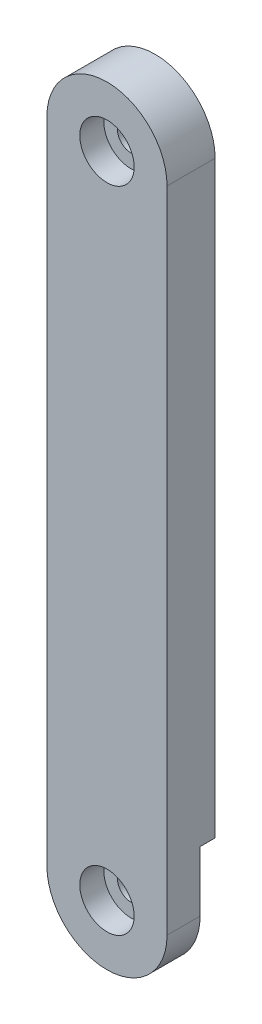
ISO-10303-21;
HEADER;
FILE_DESCRIPTION(('STEP AP214'),'2;1');
FILE_NAME('part.step','',(''),(''),'','','');
FILE_SCHEMA(('AUTOMOTIVE_DESIGN { 1 0 10303 214 1 1 1 1 }'));
ENDSEC;
DATA;
#1=APPLICATION_CONTEXT('core data for automotive mechanical design processes');
#2=APPLICATION_PROTOCOL_DEFINITION('international standard','automotive_design',2000,#1);
#3=PRODUCT_CONTEXT('',#1,'mechanical');
#4=PRODUCT('Part','Part','',(#3));
#5=PRODUCT_RELATED_PRODUCT_CATEGORY('part','',(#4));
#6=PRODUCT_DEFINITION_FORMATION('','',#4);
#7=PRODUCT_DEFINITION_CONTEXT('part definition',#1,'design');
#8=PRODUCT_DEFINITION('design','',#6,#7);
#9=PRODUCT_DEFINITION_SHAPE('','',#8);
#10=(LENGTH_UNIT() NAMED_UNIT(*) SI_UNIT(.MILLI.,.METRE.));
#11=(NAMED_UNIT(*) PLANE_ANGLE_UNIT() SI_UNIT($,.RADIAN.));
#12=(NAMED_UNIT(*) SI_UNIT($,.STERADIAN.) SOLID_ANGLE_UNIT());
#13=UNCERTAINTY_MEASURE_WITH_UNIT(LENGTH_MEASURE(1.E-05),#10,'distance_accuracy_value','');
#14=(GEOMETRIC_REPRESENTATION_CONTEXT(3) GLOBAL_UNCERTAINTY_ASSIGNED_CONTEXT((#13)) GLOBAL_UNIT_ASSIGNED_CONTEXT((#10,
#11,#12)) REPRESENTATION_CONTEXT('',''));
#15=CARTESIAN_POINT('',(0.,0.,0.));
#16=DIRECTION('',(0.,0.,1.));
#17=DIRECTION('',(1.,0.,0.));
#18=AXIS2_PLACEMENT_3D('',#15,#16,#17);
#19=CARTESIAN_POINT('',(0.,0.,0.));
#20=DIRECTION('',(0.,0.,1.));
#21=DIRECTION('',(1.,0.,0.));
#22=AXIS2_PLACEMENT_3D('',#19,#20,#21);
#23=PLANE('',#22);
#24=CARTESIAN_POINT('',(0.,108.,0.));
#25=DIRECTION('',(0.,0.,1.));
#26=DIRECTION('',(1.,0.,0.));
#27=AXIS2_PLACEMENT_3D('',#24,#25,#26);
#28=CIRCLE('',#27,2.25);
#29=CARTESIAN_POINT('',(2.25,108.,0.));
#30=VERTEX_POINT('',#29);
#31=EDGE_CURVE('E193',#30,#30,#28,.T.);
#32=ORIENTED_EDGE('',*,*,#31,.T.);
#33=EDGE_LOOP('',(#32));
#34=FACE_BOUND('',#33,.T.);
#35=CARTESIAN_POINT('',(0.,0.,0.));
#36=DIRECTION('',(0.,0.,1.));
#37=DIRECTION('',(1.,0.,0.));
#38=AXIS2_PLACEMENT_3D('',#35,#36,#37);
#39=CIRCLE('',#38,14.1509716980849);
#40=CARTESIAN_POINT('',(10.,10.0124921972504,0.));
#41=VERTEX_POINT('',#40);
#42=CARTESIAN_POINT('',(7.5,12.,0.));
#43=VERTEX_POINT('',#42);
#44=EDGE_CURVE('E261',#41,#43,#39,.T.);
#45=ORIENTED_EDGE('',*,*,#44,.T.);
#46=DIRECTION('',(0.,1.,0.));
#47=VECTOR('',#46,1.);
#48=CARTESIAN_POINT('',(7.5,12.,0.));
#49=LINE('',#48,#47);
#50=CARTESIAN_POINT('',(7.5,96.,0.));
#51=VERTEX_POINT('',#50);
#52=EDGE_CURVE('E160',#43,#51,#49,.T.);
#53=ORIENTED_EDGE('',*,*,#52,.T.);
#54=CARTESIAN_POINT('',(0.,108.,0.));
#55=DIRECTION('',(0.,0.,-1.));
#56=DIRECTION('',(-1.,0.,0.));
#57=AXIS2_PLACEMENT_3D('',#54,#55,#56);
#58=CIRCLE('',#57,14.1509716980849);
#59=CARTESIAN_POINT('',(-7.49999999999999,96.,0.));
#60=VERTEX_POINT('',#59);
#61=EDGE_CURVE('E264',#51,#60,#58,.T.);
#62=ORIENTED_EDGE('',*,*,#61,.T.);
#63=DIRECTION('',(0.,-1.,0.));
#64=VECTOR('',#63,1.);
#65=CARTESIAN_POINT('',(-7.5,96.,0.));
#66=LINE('',#65,#64);
#67=CARTESIAN_POINT('',(-7.5,12.,0.));
#68=VERTEX_POINT('',#67);
#69=EDGE_CURVE('E145',#60,#68,#66,.T.);
#70=ORIENTED_EDGE('',*,*,#69,.T.);
#71=CARTESIAN_POINT('',(-10.,10.0124921972504,0.));
#72=VERTEX_POINT('',#71);
#73=EDGE_CURVE('E254',#68,#72,#39,.T.);
#74=ORIENTED_EDGE('',*,*,#73,.T.);
#75=DIRECTION('',(0.,-1.,0.));
#76=VECTOR('',#75,1.);
#77=CARTESIAN_POINT('',(-10.,108.,0.));
#78=LINE('',#77,#76);
#79=CARTESIAN_POINT('',(-10.,108.,0.));
#80=VERTEX_POINT('',#79);
#81=EDGE_CURVE('E201',#80,#72,#78,.T.);
#82=ORIENTED_EDGE('',*,*,#81,.F.);
#83=CARTESIAN_POINT('',(0.,108.,0.));
#84=DIRECTION('',(0.,0.,1.));
#85=DIRECTION('',(1.,0.,0.));
#86=AXIS2_PLACEMENT_3D('',#83,#84,#85);
#87=CIRCLE('',#86,10.);
#88=CARTESIAN_POINT('',(10.,108.,0.));
#89=VERTEX_POINT('',#88);
#90=EDGE_CURVE('E88',#89,#80,#87,.T.);
#91=ORIENTED_EDGE('',*,*,#90,.F.);
#92=DIRECTION('',(0.,1.,0.));
#93=VECTOR('',#92,1.);
#94=CARTESIAN_POINT('',(10.,0.,0.));
#95=LINE('',#94,#93);
#96=EDGE_CURVE('E196',#41,#89,#95,.T.);
#97=ORIENTED_EDGE('',*,*,#96,.F.);
#98=EDGE_LOOP('',(#45,#53,#62,#70,#74,#82,#91,#97));
#99=FACE_BOUND('',#98,.T.);
#100=ADVANCED_FACE('F44',(#34,#99),#23,.F.);
#101=CARTESIAN_POINT('',(10.,0.,8.));
#102=DIRECTION('',(-1.,0.,0.));
#103=DIRECTION('',(0.,0.,1.));
#104=AXIS2_PLACEMENT_3D('',#101,#102,#103);
#105=PLANE('',#104);
#106=DIRECTION('',(0.,0.,-1.));
#107=VECTOR('',#106,1.);
#108=CARTESIAN_POINT('',(10.,10.0124921972504,2.5));
#109=LINE('',#108,#107);
#110=CARTESIAN_POINT('',(10.,10.0124921972504,2.5));
#111=VERTEX_POINT('',#110);
#112=EDGE_CURVE('E137',#41,#111,#109,.F.);
#113=ORIENTED_EDGE('',*,*,#112,.F.);
#114=ORIENTED_EDGE('',*,*,#96,.T.);
#115=DIRECTION('',(0.,0.,-1.));
#116=VECTOR('',#115,1.);
#117=CARTESIAN_POINT('',(10.,108.,8.));
#118=LINE('',#117,#116);
#119=CARTESIAN_POINT('',(10.,108.,8.));
#120=VERTEX_POINT('',#119);
#121=EDGE_CURVE('E223',#120,#89,#118,.T.);
#122=ORIENTED_EDGE('',*,*,#121,.F.);
#123=DIRECTION('',(0.,1.,0.));
#124=VECTOR('',#123,1.);
#125=CARTESIAN_POINT('',(10.,0.,8.));
#126=LINE('',#125,#124);
#127=CARTESIAN_POINT('',(10.,0.,8.));
#128=VERTEX_POINT('',#127);
#129=EDGE_CURVE('E94',#128,#120,#126,.T.);
#130=ORIENTED_EDGE('',*,*,#129,.F.);
#131=DIRECTION('',(0.,0.,-1.));
#132=VECTOR('',#131,1.);
#133=CARTESIAN_POINT('',(10.,0.,8.));
#134=LINE('',#133,#132);
#135=CARTESIAN_POINT('',(10.,0.,2.5));
#136=VERTEX_POINT('',#135);
#137=EDGE_CURVE('E229',#128,#136,#134,.T.);
#138=ORIENTED_EDGE('',*,*,#137,.T.);
#139=DIRECTION('',(0.,1.,0.));
#140=VECTOR('',#139,1.);
#141=CARTESIAN_POINT('',(10.,0.,2.5));
#142=LINE('',#141,#140);
#143=EDGE_CURVE('E162',#136,#111,#142,.T.);
#144=ORIENTED_EDGE('',*,*,#143,.T.);
#145=EDGE_LOOP('',(#113,#114,#122,#130,#138,#144));
#146=FACE_BOUND('',#145,.T.);
#147=ADVANCED_FACE('F246',(#146),#105,.F.);
#148=CARTESIAN_POINT('',(-10.,108.,8.));
#149=DIRECTION('',(1.,0.,0.));
#150=DIRECTION('',(0.,0.,-1.));
#151=AXIS2_PLACEMENT_3D('',#148,#149,#150);
#152=PLANE('',#151);
#153=DIRECTION('',(0.,0.,-1.));
#154=VECTOR('',#153,1.);
#155=CARTESIAN_POINT('',(-10.,10.0124921972504,2.5));
#156=LINE('',#155,#154);
#157=CARTESIAN_POINT('',(-10.,10.0124921972504,2.5));
#158=VERTEX_POINT('',#157);
#159=EDGE_CURVE('E11',#158,#72,#156,.T.);
#160=ORIENTED_EDGE('',*,*,#159,.F.);
#161=DIRECTION('',(0.,-1.,0.));
#162=VECTOR('',#161,1.);
#163=CARTESIAN_POINT('',(-10.,108.,2.5));
#164=LINE('',#163,#162);
#165=CARTESIAN_POINT('',(-10.,0.,2.5));
#166=VERTEX_POINT('',#165);
#167=EDGE_CURVE('E53',#158,#166,#164,.T.);
#168=ORIENTED_EDGE('',*,*,#167,.T.);
#169=DIRECTION('',(0.,0.,-1.));
#170=VECTOR('',#169,1.);
#171=CARTESIAN_POINT('',(-10.,0.,8.));
#172=LINE('',#171,#170);
#173=CARTESIAN_POINT('',(-10.,0.,8.));
#174=VERTEX_POINT('',#173);
#175=EDGE_CURVE('E211',#174,#166,#172,.T.);
#176=ORIENTED_EDGE('',*,*,#175,.F.);
#177=DIRECTION('',(0.,-1.,0.));
#178=VECTOR('',#177,1.);
#179=CARTESIAN_POINT('',(-10.,108.,8.));
#180=LINE('',#179,#178);
#181=CARTESIAN_POINT('',(-10.,108.,8.));
#182=VERTEX_POINT('',#181);
#183=EDGE_CURVE('E67',#182,#174,#180,.T.);
#184=ORIENTED_EDGE('',*,*,#183,.F.);
#185=DIRECTION('',(0.,0.,-1.));
#186=VECTOR('',#185,1.);
#187=CARTESIAN_POINT('',(-10.,108.,8.));
#188=LINE('',#187,#186);
#189=EDGE_CURVE('E225',#182,#80,#188,.T.);
#190=ORIENTED_EDGE('',*,*,#189,.T.);
#191=ORIENTED_EDGE('',*,*,#81,.T.);
#192=EDGE_LOOP('',(#160,#168,#176,#184,#190,#191));
#193=FACE_BOUND('',#192,.T.);
#194=ADVANCED_FACE('F239',(#193),#152,.F.);
#195=CARTESIAN_POINT('',(0.,0.,8.));
#196=DIRECTION('',(0.,0.,-1.));
#197=DIRECTION('',(-1.,0.,0.));
#198=AXIS2_PLACEMENT_3D('',#195,#196,#197);
#199=CYLINDRICAL_SURFACE('',#198,2.25);
#200=CARTESIAN_POINT('',(0.,0.,2.5));
#201=DIRECTION('',(0.,0.,1.));
#202=DIRECTION('',(1.,0.,0.));
#203=AXIS2_PLACEMENT_3D('',#200,#201,#202);
#204=CIRCLE('',#203,2.25);
#205=CARTESIAN_POINT('',(2.25,0.,2.5));
#206=VERTEX_POINT('',#205);
#207=EDGE_CURVE('E172',#206,#206,#204,.T.);
#208=ORIENTED_EDGE('',*,*,#207,.F.);
#209=EDGE_LOOP('',(#208));
#210=FACE_BOUND('',#209,.T.);
#211=CARTESIAN_POINT('',(0.,0.,4.));
#212=DIRECTION('',(0.,0.,1.));
#213=DIRECTION('',(1.,0.,0.));
#214=AXIS2_PLACEMENT_3D('',#211,#212,#213);
#215=CIRCLE('',#214,2.25);
#216=CARTESIAN_POINT('',(2.25,0.,4.));
#217=VERTEX_POINT('',#216);
#218=EDGE_CURVE('E200',#217,#217,#215,.T.);
#219=ORIENTED_EDGE('',*,*,#218,.T.);
#220=EDGE_LOOP('',(#219));
#221=FACE_BOUND('',#220,.T.);
#222=ADVANCED_FACE('F313',(#210,#221),#199,.F.);
#223=CARTESIAN_POINT('',(0.,108.,8.));
#224=DIRECTION('',(0.,0.,-1.));
#225=DIRECTION('',(-1.,0.,0.));
#226=AXIS2_PLACEMENT_3D('',#223,#224,#225);
#227=CYLINDRICAL_SURFACE('',#226,2.25);
#228=ORIENTED_EDGE('',*,*,#31,.F.);
#229=EDGE_LOOP('',(#228));
#230=FACE_BOUND('',#229,.T.);
#231=CARTESIAN_POINT('',(0.,108.,4.));
#232=DIRECTION('',(0.,0.,1.));
#233=DIRECTION('',(1.,0.,0.));
#234=AXIS2_PLACEMENT_3D('',#231,#232,#233);
#235=CIRCLE('',#234,2.25);
#236=CARTESIAN_POINT('',(2.25,108.,4.));
#237=VERTEX_POINT('',#236);
#238=EDGE_CURVE('E185',#237,#237,#235,.T.);
#239=ORIENTED_EDGE('',*,*,#238,.T.);
#240=EDGE_LOOP('',(#239));
#241=FACE_BOUND('',#240,.T.);
#242=ADVANCED_FACE('F326',(#230,#241),#227,.F.);
#243=CARTESIAN_POINT('',(0.,0.,8.));
#244=DIRECTION('',(0.,0.,1.));
#245=DIRECTION('',(1.,0.,0.));
#246=AXIS2_PLACEMENT_3D('',#243,#244,#245);
#247=PLANE('',#246);
#248=CARTESIAN_POINT('',(0.,0.,8.));
#249=DIRECTION('',(0.,0.,1.));
#250=DIRECTION('',(1.,0.,0.));
#251=AXIS2_PLACEMENT_3D('',#248,#249,#250);
#252=CIRCLE('',#251,4.525);
#253=CARTESIAN_POINT('',(4.525,0.,8.));
#254=VERTEX_POINT('',#253);
#255=EDGE_CURVE('E181',#254,#254,#252,.T.);
#256=ORIENTED_EDGE('',*,*,#255,.F.);
#257=EDGE_LOOP('',(#256));
#258=FACE_BOUND('',#257,.T.);
#259=CARTESIAN_POINT('',(0.,108.,8.));
#260=DIRECTION('',(0.,0.,1.));
#261=DIRECTION('',(1.,0.,0.));
#262=AXIS2_PLACEMENT_3D('',#259,#260,#261);
#263=CIRCLE('',#262,4.525);
#264=CARTESIAN_POINT('',(4.525,108.,8.));
#265=VERTEX_POINT('',#264);
#266=EDGE_CURVE('E190',#265,#265,#263,.T.);
#267=ORIENTED_EDGE('',*,*,#266,.F.);
#268=EDGE_LOOP('',(#267));
#269=FACE_BOUND('',#268,.T.);
#270=CARTESIAN_POINT('',(0.,0.,8.));
#271=DIRECTION('',(0.,0.,1.));
#272=DIRECTION('',(1.,0.,0.));
#273=AXIS2_PLACEMENT_3D('',#270,#271,#272);
#274=CIRCLE('',#273,10.);
#275=EDGE_CURVE('E199',#174,#128,#274,.T.);
#276=ORIENTED_EDGE('',*,*,#275,.T.);
#277=ORIENTED_EDGE('',*,*,#129,.T.);
#278=CARTESIAN_POINT('',(0.,108.,8.));
#279=DIRECTION('',(0.,0.,1.));
#280=DIRECTION('',(1.,0.,0.));
#281=AXIS2_PLACEMENT_3D('',#278,#279,#280);
#282=CIRCLE('',#281,10.);
#283=EDGE_CURVE('E206',#120,#182,#282,.T.);
#284=ORIENTED_EDGE('',*,*,#283,.T.);
#285=ORIENTED_EDGE('',*,*,#183,.T.);
#286=EDGE_LOOP('',(#276,#277,#284,#285));
#287=FACE_BOUND('',#286,.T.);
#288=ADVANCED_FACE('F243',(#258,#269,#287),#247,.T.);
#289=CARTESIAN_POINT('',(0.,0.,8.));
#290=DIRECTION('',(0.,0.,-1.));
#291=DIRECTION('',(-1.,0.,0.));
#292=AXIS2_PLACEMENT_3D('',#289,#290,#291);
#293=CYLINDRICAL_SURFACE('',#292,10.);
#294=ORIENTED_EDGE('',*,*,#175,.T.);
#295=CARTESIAN_POINT('',(0.,0.,2.5));
#296=DIRECTION('',(0.,0.,1.));
#297=DIRECTION('',(1.,0.,0.));
#298=AXIS2_PLACEMENT_3D('',#295,#296,#297);
#299=CIRCLE('',#298,10.);
#300=EDGE_CURVE('E62',#166,#136,#299,.T.);
#301=ORIENTED_EDGE('',*,*,#300,.T.);
#302=ORIENTED_EDGE('',*,*,#137,.F.);
#303=ORIENTED_EDGE('',*,*,#275,.F.);
#304=EDGE_LOOP('',(#294,#301,#302,#303));
#305=FACE_BOUND('',#304,.T.);
#306=ADVANCED_FACE('F50',(#305),#293,.T.);
#307=CARTESIAN_POINT('',(0.,108.,8.));
#308=DIRECTION('',(0.,0.,-1.));
#309=DIRECTION('',(-1.,0.,0.));
#310=AXIS2_PLACEMENT_3D('',#307,#308,#309);
#311=CYLINDRICAL_SURFACE('',#310,10.);
#312=ORIENTED_EDGE('',*,*,#90,.T.);
#313=ORIENTED_EDGE('',*,*,#189,.F.);
#314=ORIENTED_EDGE('',*,*,#283,.F.);
#315=ORIENTED_EDGE('',*,*,#121,.T.);
#316=EDGE_LOOP('',(#312,#313,#314,#315));
#317=FACE_BOUND('',#316,.T.);
#318=ADVANCED_FACE('F248',(#317),#311,.T.);
#319=CARTESIAN_POINT('',(0.,108.,4.));
#320=DIRECTION('',(0.,0.,1.));
#321=DIRECTION('',(1.,0.,0.));
#322=AXIS2_PLACEMENT_3D('',#319,#320,#321);
#323=CYLINDRICAL_SURFACE('',#322,4.525);
#324=CARTESIAN_POINT('',(0.,108.,4.));
#325=DIRECTION('',(0.,0.,1.));
#326=DIRECTION('',(1.,0.,0.));
#327=AXIS2_PLACEMENT_3D('',#324,#325,#326);
#328=CIRCLE('',#327,4.525);
#329=CARTESIAN_POINT('',(4.525,108.,4.));
#330=VERTEX_POINT('',#329);
#331=EDGE_CURVE('E176',#330,#330,#328,.T.);
#332=ORIENTED_EDGE('',*,*,#331,.F.);
#333=EDGE_LOOP('',(#332));
#334=FACE_BOUND('',#333,.T.);
#335=ORIENTED_EDGE('',*,*,#266,.T.);
#336=EDGE_LOOP('',(#335));
#337=FACE_BOUND('',#336,.T.);
#338=ADVANCED_FACE('F311',(#334,#337),#323,.F.);
#339=CARTESIAN_POINT('',(0.,108.,4.));
#340=DIRECTION('',(0.,0.,1.));
#341=DIRECTION('',(1.,0.,0.));
#342=AXIS2_PLACEMENT_3D('',#339,#340,#341);
#343=PLANE('',#342);
#344=ORIENTED_EDGE('',*,*,#238,.F.);
#345=EDGE_LOOP('',(#344));
#346=FACE_BOUND('',#345,.T.);
#347=ORIENTED_EDGE('',*,*,#331,.T.);
#348=EDGE_LOOP('',(#347));
#349=FACE_BOUND('',#348,.T.);
#350=ADVANCED_FACE('F318',(#346,#349),#343,.T.);
#351=CARTESIAN_POINT('',(0.,0.,4.));
#352=DIRECTION('',(0.,0.,1.));
#353=DIRECTION('',(1.,0.,0.));
#354=AXIS2_PLACEMENT_3D('',#351,#352,#353);
#355=CYLINDRICAL_SURFACE('',#354,4.525);
#356=CARTESIAN_POINT('',(0.,0.,4.));
#357=DIRECTION('',(0.,0.,1.));
#358=DIRECTION('',(1.,0.,0.));
#359=AXIS2_PLACEMENT_3D('',#356,#357,#358);
#360=CIRCLE('',#359,4.525);
#361=CARTESIAN_POINT('',(4.525,0.,4.));
#362=VERTEX_POINT('',#361);
#363=EDGE_CURVE('E180',#362,#362,#360,.T.);
#364=ORIENTED_EDGE('',*,*,#363,.F.);
#365=EDGE_LOOP('',(#364));
#366=FACE_BOUND('',#365,.T.);
#367=ORIENTED_EDGE('',*,*,#255,.T.);
#368=EDGE_LOOP('',(#367));
#369=FACE_BOUND('',#368,.T.);
#370=ADVANCED_FACE('F340',(#366,#369),#355,.F.);
#371=CARTESIAN_POINT('',(0.,0.,4.));
#372=DIRECTION('',(0.,0.,1.));
#373=DIRECTION('',(1.,0.,0.));
#374=AXIS2_PLACEMENT_3D('',#371,#372,#373);
#375=PLANE('',#374);
#376=ORIENTED_EDGE('',*,*,#218,.F.);
#377=EDGE_LOOP('',(#376));
#378=FACE_BOUND('',#377,.T.);
#379=ORIENTED_EDGE('',*,*,#363,.T.);
#380=EDGE_LOOP('',(#379));
#381=FACE_BOUND('',#380,.T.);
#382=ADVANCED_FACE('F297',(#378,#381),#375,.T.);
#383=CARTESIAN_POINT('',(0.,0.,2.5));
#384=DIRECTION('',(0.,0.,-1.));
#385=DIRECTION('',(-1.,0.,0.));
#386=AXIS2_PLACEMENT_3D('',#383,#384,#385);
#387=CYLINDRICAL_SURFACE('',#386,14.1509716980849);
#388=ORIENTED_EDGE('',*,*,#112,.T.);
#389=CARTESIAN_POINT('',(0.,0.,2.5));
#390=DIRECTION('',(0.,0.,1.));
#391=DIRECTION('',(1.,0.,0.));
#392=AXIS2_PLACEMENT_3D('',#389,#390,#391);
#393=CIRCLE('',#392,14.1509716980849);
#394=CARTESIAN_POINT('',(7.5,12.,2.5));
#395=VERTEX_POINT('',#394);
#396=EDGE_CURVE('E134',#111,#395,#393,.T.);
#397=ORIENTED_EDGE('',*,*,#396,.T.);
#398=DIRECTION('',(0.,0.,-1.));
#399=VECTOR('',#398,1.);
#400=CARTESIAN_POINT('',(7.5,12.,2.5));
#401=LINE('',#400,#399);
#402=EDGE_CURVE('E136',#395,#43,#401,.T.);
#403=ORIENTED_EDGE('',*,*,#402,.T.);
#404=ORIENTED_EDGE('',*,*,#44,.F.);
#405=EDGE_LOOP('',(#388,#397,#403,#404));
#406=FACE_BOUND('',#405,.T.);
#407=ADVANCED_FACE('F133',(#406),#387,.F.);
#408=ORIENTED_EDGE('',*,*,#159,.T.);
#409=ORIENTED_EDGE('',*,*,#73,.F.);
#410=DIRECTION('',(0.,0.,-1.));
#411=VECTOR('',#410,1.);
#412=CARTESIAN_POINT('',(-7.5,12.,2.5));
#413=LINE('',#412,#411);
#414=CARTESIAN_POINT('',(-7.5,12.,2.5));
#415=VERTEX_POINT('',#414);
#416=EDGE_CURVE('E274',#415,#68,#413,.T.);
#417=ORIENTED_EDGE('',*,*,#416,.F.);
#418=EDGE_CURVE('E141',#415,#158,#393,.T.);
#419=ORIENTED_EDGE('',*,*,#418,.T.);
#420=EDGE_LOOP('',(#408,#409,#417,#419));
#421=FACE_BOUND('',#420,.T.);
#422=ADVANCED_FACE('F281',(#421),#387,.F.);
#423=CARTESIAN_POINT('',(0.,0.,2.5));
#424=DIRECTION('',(0.,0.,1.));
#425=DIRECTION('',(1.,0.,0.));
#426=AXIS2_PLACEMENT_3D('',#423,#424,#425);
#427=PLANE('',#426);
#428=ORIENTED_EDGE('',*,*,#207,.T.);
#429=EDGE_LOOP('',(#428));
#430=FACE_BOUND('',#429,.T.);
#431=ORIENTED_EDGE('',*,*,#300,.F.);
#432=ORIENTED_EDGE('',*,*,#167,.F.);
#433=ORIENTED_EDGE('',*,*,#418,.F.);
#434=DIRECTION('',(0.,-1.,0.));
#435=VECTOR('',#434,1.);
#436=CARTESIAN_POINT('',(-7.5,96.,2.5));
#437=LINE('',#436,#435);
#438=CARTESIAN_POINT('',(-7.49999999999999,96.,2.5));
#439=VERTEX_POINT('',#438);
#440=EDGE_CURVE('E268',#439,#415,#437,.T.);
#441=ORIENTED_EDGE('',*,*,#440,.F.);
#442=CARTESIAN_POINT('',(0.,108.,2.5));
#443=DIRECTION('',(0.,0.,-1.));
#444=DIRECTION('',(-1.,0.,0.));
#445=AXIS2_PLACEMENT_3D('',#442,#443,#444);
#446=CIRCLE('',#445,14.1509716980849);
#447=CARTESIAN_POINT('',(7.5,96.,2.5));
#448=VERTEX_POINT('',#447);
#449=EDGE_CURVE('E147',#448,#439,#446,.T.);
#450=ORIENTED_EDGE('',*,*,#449,.F.);
#451=DIRECTION('',(0.,1.,0.));
#452=VECTOR('',#451,1.);
#453=CARTESIAN_POINT('',(7.5,12.,2.5));
#454=LINE('',#453,#452);
#455=EDGE_CURVE('E150',#395,#448,#454,.T.);
#456=ORIENTED_EDGE('',*,*,#455,.F.);
#457=ORIENTED_EDGE('',*,*,#396,.F.);
#458=ORIENTED_EDGE('',*,*,#143,.F.);
#459=EDGE_LOOP('',(#431,#432,#433,#441,#450,#456,#457,#458));
#460=FACE_BOUND('',#459,.T.);
#461=ADVANCED_FACE('F146',(#430,#460),#427,.F.);
#462=CARTESIAN_POINT('',(7.5,12.,2.5));
#463=DIRECTION('',(-1.,0.,0.));
#464=DIRECTION('',(0.,0.,1.));
#465=AXIS2_PLACEMENT_3D('',#462,#463,#464);
#466=PLANE('',#465);
#467=ORIENTED_EDGE('',*,*,#52,.F.);
#468=ORIENTED_EDGE('',*,*,#402,.F.);
#469=ORIENTED_EDGE('',*,*,#455,.T.);
#470=DIRECTION('',(0.,0.,-1.));
#471=VECTOR('',#470,1.);
#472=CARTESIAN_POINT('',(7.5,96.,2.5));
#473=LINE('',#472,#471);
#474=EDGE_CURVE('E157',#448,#51,#473,.T.);
#475=ORIENTED_EDGE('',*,*,#474,.T.);
#476=EDGE_LOOP('',(#467,#468,#469,#475));
#477=FACE_BOUND('',#476,.T.);
#478=ADVANCED_FACE('F154',(#477),#466,.T.);
#479=CARTESIAN_POINT('',(0.,108.,2.5));
#480=DIRECTION('',(0.,0.,-1.));
#481=DIRECTION('',(-1.,0.,0.));
#482=AXIS2_PLACEMENT_3D('',#479,#480,#481);
#483=CYLINDRICAL_SURFACE('',#482,14.1509716980849);
#484=ORIENTED_EDGE('',*,*,#61,.F.);
#485=ORIENTED_EDGE('',*,*,#474,.F.);
#486=ORIENTED_EDGE('',*,*,#449,.T.);
#487=DIRECTION('',(0.,0.,-1.));
#488=VECTOR('',#487,1.);
#489=CARTESIAN_POINT('',(-7.49999999999999,96.,2.5));
#490=LINE('',#489,#488);
#491=EDGE_CURVE('E164',#439,#60,#490,.T.);
#492=ORIENTED_EDGE('',*,*,#491,.T.);
#493=EDGE_LOOP('',(#484,#485,#486,#492));
#494=FACE_BOUND('',#493,.T.);
#495=ADVANCED_FACE('F282',(#494),#483,.T.);
#496=CARTESIAN_POINT('',(-7.5,96.,2.5));
#497=DIRECTION('',(1.,0.,0.));
#498=DIRECTION('',(0.,0.,-1.));
#499=AXIS2_PLACEMENT_3D('',#496,#497,#498);
#500=PLANE('',#499);
#501=ORIENTED_EDGE('',*,*,#69,.F.);
#502=ORIENTED_EDGE('',*,*,#491,.F.);
#503=ORIENTED_EDGE('',*,*,#440,.T.);
#504=ORIENTED_EDGE('',*,*,#416,.T.);
#505=EDGE_LOOP('',(#501,#502,#503,#504));
#506=FACE_BOUND('',#505,.T.);
#507=ADVANCED_FACE('F284',(#506),#500,.T.);
#508=CLOSED_SHELL('',(#100,#147,#194,#222,#242,#288,#306,#318,#338,#350,#370,#382,#407,#422,
#461,#478,#495,#507));
#509=MANIFOLD_SOLID_BREP('B2',#508);
#510=ADVANCED_BREP_SHAPE_REPRESENTATION('',(#18,#509),#14);
#511=SHAPE_DEFINITION_REPRESENTATION(#9,#510);
ENDSEC;
END-ISO-10303-21;
